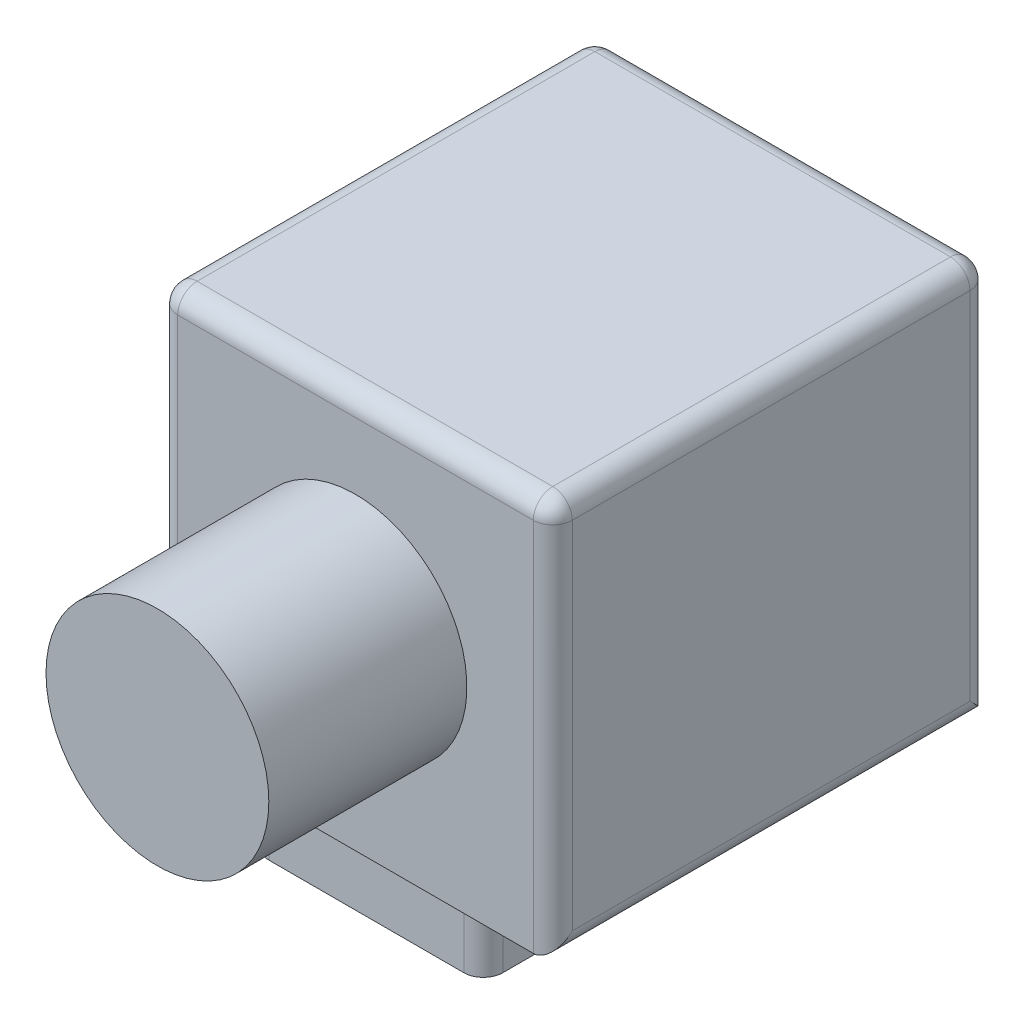
ISO-10303-21;
HEADER;
FILE_DESCRIPTION(('STEP AP214'),'2;1');
FILE_NAME('part.step','',(''),(''),'','','');
FILE_SCHEMA(('AUTOMOTIVE_DESIGN { 1 0 10303 214 1 1 1 1 }'));
ENDSEC;
DATA;
#1=APPLICATION_CONTEXT('core data for automotive mechanical design processes');
#2=APPLICATION_PROTOCOL_DEFINITION('international standard','automotive_design',2000,#1);
#3=PRODUCT_CONTEXT('',#1,'mechanical');
#4=PRODUCT('Part','Part','',(#3));
#5=PRODUCT_RELATED_PRODUCT_CATEGORY('part','',(#4));
#6=PRODUCT_DEFINITION_FORMATION('','',#4);
#7=PRODUCT_DEFINITION_CONTEXT('part definition',#1,'design');
#8=PRODUCT_DEFINITION('design','',#6,#7);
#9=PRODUCT_DEFINITION_SHAPE('','',#8);
#10=(LENGTH_UNIT() NAMED_UNIT(*) SI_UNIT(.MILLI.,.METRE.));
#11=(NAMED_UNIT(*) PLANE_ANGLE_UNIT() SI_UNIT($,.RADIAN.));
#12=(NAMED_UNIT(*) SI_UNIT($,.STERADIAN.) SOLID_ANGLE_UNIT());
#13=UNCERTAINTY_MEASURE_WITH_UNIT(LENGTH_MEASURE(1.E-05),#10,'distance_accuracy_value','');
#14=(GEOMETRIC_REPRESENTATION_CONTEXT(3) GLOBAL_UNCERTAINTY_ASSIGNED_CONTEXT((#13)) GLOBAL_UNIT_ASSIGNED_CONTEXT((#10,
#11,#12)) REPRESENTATION_CONTEXT('',''));
#15=CARTESIAN_POINT('',(0.,0.,0.));
#16=DIRECTION('',(0.,0.,1.));
#17=DIRECTION('',(1.,0.,0.));
#18=AXIS2_PLACEMENT_3D('',#15,#16,#17);
#19=CARTESIAN_POINT('',(0.,50.6,0.));
#20=DIRECTION('',(0.,0.,-1.));
#21=DIRECTION('',(-1.,0.,0.));
#22=AXIS2_PLACEMENT_3D('',#19,#20,#21);
#23=PLANE('',#22);
#24=DIRECTION('',(1.,0.,0.));
#25=VECTOR('',#24,1.);
#26=CARTESIAN_POINT('',(0.,48.1,0.));
#27=LINE('',#26,#25);
#28=CARTESIAN_POINT('',(48.1,48.1,0.));
#29=VERTEX_POINT('',#28);
#30=CARTESIAN_POINT('',(2.5,48.1,0.));
#31=VERTEX_POINT('',#30);
#32=EDGE_CURVE('E266',#29,#31,#27,.F.);
#33=ORIENTED_EDGE('',*,*,#32,.T.);
#34=DIRECTION('',(0.,-1.,0.));
#35=VECTOR('',#34,1.);
#36=CARTESIAN_POINT('',(2.5,50.6,0.));
#37=LINE('',#36,#35);
#38=CARTESIAN_POINT('',(2.5,0.,0.));
#39=VERTEX_POINT('',#38);
#40=EDGE_CURVE('E270',#31,#39,#37,.T.);
#41=ORIENTED_EDGE('',*,*,#40,.T.);
#42=DIRECTION('',(1.,0.,0.));
#43=VECTOR('',#42,1.);
#44=CARTESIAN_POINT('',(0.,0.,0.));
#45=LINE('',#44,#43);
#46=CARTESIAN_POINT('',(48.1,0.,0.));
#47=VERTEX_POINT('',#46);
#48=EDGE_CURVE('E223',#39,#47,#45,.T.);
#49=ORIENTED_EDGE('',*,*,#48,.T.);
#50=DIRECTION('',(0.,-1.,0.));
#51=VECTOR('',#50,1.);
#52=CARTESIAN_POINT('',(48.1,50.6,0.));
#53=LINE('',#52,#51);
#54=EDGE_CURVE('E268',#47,#29,#53,.F.);
#55=ORIENTED_EDGE('',*,*,#54,.T.);
#56=EDGE_LOOP('',(#33,#41,#49,#55));
#57=FACE_BOUND('',#56,.T.);
#58=CARTESIAN_POINT('',(25.3,25.3,0.));
#59=DIRECTION('',(0.,0.,-1.));
#60=DIRECTION('',(-1.,0.,0.));
#61=AXIS2_PLACEMENT_3D('',#58,#59,#60);
#62=CIRCLE('',#61,14.2875);
#63=CARTESIAN_POINT('',(11.0125,25.3,0.));
#64=VERTEX_POINT('',#63);
#65=EDGE_CURVE('E238',#64,#64,#62,.F.);
#66=ORIENTED_EDGE('',*,*,#65,.F.);
#67=EDGE_LOOP('',(#66));
#68=FACE_BOUND('',#67,.T.);
#69=ADVANCED_FACE('F38',(#57,#68),#23,.F.);
#70=CARTESIAN_POINT('',(0.,0.,-56.));
#71=DIRECTION('',(0.,-1.,0.));
#72=DIRECTION('',(0.,0.,-1.));
#73=AXIS2_PLACEMENT_3D('',#70,#71,#72);
#74=PLANE('',#73);
#75=ORIENTED_EDGE('',*,*,#48,.F.);
#76=DIRECTION('',(0.,0.,1.));
#77=VECTOR('',#76,1.);
#78=CARTESIAN_POINT('',(2.5,0.,-56.));
#79=LINE('',#78,#77);
#80=CARTESIAN_POINT('',(2.5,0.,-56.));
#81=VERTEX_POINT('',#80);
#82=EDGE_CURVE('E310',#39,#81,#79,.F.);
#83=ORIENTED_EDGE('',*,*,#82,.T.);
#84=DIRECTION('',(-1.,0.,0.));
#85=VECTOR('',#84,1.);
#86=CARTESIAN_POINT('',(0.,0.,-56.));
#87=LINE('',#86,#85);
#88=CARTESIAN_POINT('',(48.1,0.,-56.));
#89=VERTEX_POINT('',#88);
#90=EDGE_CURVE('E235',#89,#81,#87,.T.);
#91=ORIENTED_EDGE('',*,*,#90,.F.);
#92=DIRECTION('',(0.,0.,-1.));
#93=VECTOR('',#92,1.);
#94=CARTESIAN_POINT('',(48.1,0.,0.));
#95=LINE('',#94,#93);
#96=EDGE_CURVE('E308',#89,#47,#95,.F.);
#97=ORIENTED_EDGE('',*,*,#96,.T.);
#98=EDGE_LOOP('',(#75,#83,#91,#97));
#99=FACE_BOUND('',#98,.T.);
#100=DIRECTION('',(1.,0.,0.));
#101=VECTOR('',#100,1.);
#102=CARTESIAN_POINT('',(10.3,0.,-54.6));
#103=LINE('',#102,#101);
#104=CARTESIAN_POINT('',(12.8,0.,-54.6));
#105=VERTEX_POINT('',#104);
#106=CARTESIAN_POINT('',(37.8,0.,-54.6));
#107=VERTEX_POINT('',#106);
#108=EDGE_CURVE('E226',#105,#107,#103,.T.);
#109=ORIENTED_EDGE('',*,*,#108,.F.);
#110=CARTESIAN_POINT('',(12.8,0.,-52.1));
#111=DIRECTION('',(0.,-1.,0.));
#112=DIRECTION('',(0.,0.,-1.));
#113=AXIS2_PLACEMENT_3D('',#110,#111,#112);
#114=CIRCLE('',#113,2.5);
#115=CARTESIAN_POINT('',(10.3,0.,-52.1));
#116=VERTEX_POINT('',#115);
#117=EDGE_CURVE('E314',#105,#116,#114,.F.);
#118=ORIENTED_EDGE('',*,*,#117,.T.);
#119=DIRECTION('',(0.,0.,-1.));
#120=VECTOR('',#119,1.);
#121=CARTESIAN_POINT('',(10.3,0.,-1.4));
#122=LINE('',#121,#120);
#123=CARTESIAN_POINT('',(10.3,0.,-3.9));
#124=VERTEX_POINT('',#123);
#125=EDGE_CURVE('E209',#124,#116,#122,.T.);
#126=ORIENTED_EDGE('',*,*,#125,.F.);
#127=CARTESIAN_POINT('',(12.8,0.,-3.9));
#128=DIRECTION('',(0.,-1.,0.));
#129=DIRECTION('',(0.,0.,-1.));
#130=AXIS2_PLACEMENT_3D('',#127,#128,#129);
#131=CIRCLE('',#130,2.5);
#132=CARTESIAN_POINT('',(12.8,0.,-1.4));
#133=VERTEX_POINT('',#132);
#134=EDGE_CURVE('E11',#124,#133,#131,.F.);
#135=ORIENTED_EDGE('',*,*,#134,.T.);
#136=DIRECTION('',(-1.,0.,0.));
#137=VECTOR('',#136,1.);
#138=CARTESIAN_POINT('',(10.3,0.,-1.4));
#139=LINE('',#138,#137);
#140=CARTESIAN_POINT('',(37.8,0.,-1.39999999999999));
#141=VERTEX_POINT('',#140);
#142=EDGE_CURVE('E214',#141,#133,#139,.T.);
#143=ORIENTED_EDGE('',*,*,#142,.F.);
#144=CARTESIAN_POINT('',(37.8,0.,-3.89999999999999));
#145=DIRECTION('',(0.,-1.,0.));
#146=DIRECTION('',(0.,0.,-1.));
#147=AXIS2_PLACEMENT_3D('',#144,#145,#146);
#148=CIRCLE('',#147,2.5);
#149=CARTESIAN_POINT('',(40.3,0.,-3.89999999999999));
#150=VERTEX_POINT('',#149);
#151=EDGE_CURVE('E47',#141,#150,#148,.F.);
#152=ORIENTED_EDGE('',*,*,#151,.T.);
#153=DIRECTION('',(0.,0.,1.));
#154=VECTOR('',#153,1.);
#155=CARTESIAN_POINT('',(40.3,0.,-1.39999999999999));
#156=LINE('',#155,#154);
#157=CARTESIAN_POINT('',(40.3,0.,-52.1));
#158=VERTEX_POINT('',#157);
#159=EDGE_CURVE('E229',#158,#150,#156,.T.);
#160=ORIENTED_EDGE('',*,*,#159,.F.);
#161=CARTESIAN_POINT('',(37.8,0.,-52.1));
#162=DIRECTION('',(0.,-1.,0.));
#163=DIRECTION('',(0.,0.,-1.));
#164=AXIS2_PLACEMENT_3D('',#161,#162,#163);
#165=CIRCLE('',#164,2.5);
#166=EDGE_CURVE('E312',#158,#107,#165,.F.);
#167=ORIENTED_EDGE('',*,*,#166,.T.);
#168=EDGE_LOOP('',(#109,#118,#126,#135,#143,#152,#160,#167));
#169=FACE_BOUND('',#168,.T.);
#170=ADVANCED_FACE('F378',(#99,#169),#74,.T.);
#171=CARTESIAN_POINT('',(0.,50.6,0.));
#172=DIRECTION('',(1.,0.,0.));
#173=DIRECTION('',(0.,0.,-1.));
#174=AXIS2_PLACEMENT_3D('',#171,#172,#173);
#175=PLANE('',#174);
#176=DIRECTION('',(0.,-1.,0.));
#177=VECTOR('',#176,1.);
#178=CARTESIAN_POINT('',(0.,50.6,-53.5));
#179=LINE('',#178,#177);
#180=CARTESIAN_POINT('',(0.,48.1,-53.5));
#181=VERTEX_POINT('',#180);
#182=CARTESIAN_POINT('',(0.,2.5,-53.5));
#183=VERTEX_POINT('',#182);
#184=EDGE_CURVE('E245',#181,#183,#179,.T.);
#185=ORIENTED_EDGE('',*,*,#184,.T.);
#186=DIRECTION('',(0.,0.,1.));
#187=VECTOR('',#186,1.);
#188=CARTESIAN_POINT('',(0.,2.5,0.));
#189=LINE('',#188,#187);
#190=CARTESIAN_POINT('',(0.,2.5,-2.5));
#191=VERTEX_POINT('',#190);
#192=EDGE_CURVE('E248',#183,#191,#189,.T.);
#193=ORIENTED_EDGE('',*,*,#192,.T.);
#194=DIRECTION('',(0.,-1.,0.));
#195=VECTOR('',#194,1.);
#196=CARTESIAN_POINT('',(0.,50.6,-2.5));
#197=LINE('',#196,#195);
#198=CARTESIAN_POINT('',(0.,48.1,-2.5));
#199=VERTEX_POINT('',#198);
#200=EDGE_CURVE('E243',#191,#199,#197,.F.);
#201=ORIENTED_EDGE('',*,*,#200,.T.);
#202=DIRECTION('',(0.,0.,1.));
#203=VECTOR('',#202,1.);
#204=CARTESIAN_POINT('',(0.,48.1,0.));
#205=LINE('',#204,#203);
#206=EDGE_CURVE('E241',#199,#181,#205,.F.);
#207=ORIENTED_EDGE('',*,*,#206,.T.);
#208=EDGE_LOOP('',(#185,#193,#201,#207));
#209=FACE_BOUND('',#208,.T.);
#210=ADVANCED_FACE('F384',(#209),#175,.F.);
#211=CARTESIAN_POINT('',(50.6,50.6,0.));
#212=DIRECTION('',(-1.,0.,0.));
#213=DIRECTION('',(0.,0.,1.));
#214=AXIS2_PLACEMENT_3D('',#211,#212,#213);
#215=PLANE('',#214);
#216=DIRECTION('',(0.,-1.,0.));
#217=VECTOR('',#216,1.);
#218=CARTESIAN_POINT('',(50.6,50.6,-2.5));
#219=LINE('',#218,#217);
#220=CARTESIAN_POINT('',(50.6,48.1,-2.5));
#221=VERTEX_POINT('',#220);
#222=CARTESIAN_POINT('',(50.6,2.5,-2.5));
#223=VERTEX_POINT('',#222);
#224=EDGE_CURVE('E259',#221,#223,#219,.T.);
#225=ORIENTED_EDGE('',*,*,#224,.T.);
#226=DIRECTION('',(0.,0.,-1.));
#227=VECTOR('',#226,1.);
#228=CARTESIAN_POINT('',(50.6,2.5,-56.));
#229=LINE('',#228,#227);
#230=CARTESIAN_POINT('',(50.6,2.5,-53.5));
#231=VERTEX_POINT('',#230);
#232=EDGE_CURVE('E264',#223,#231,#229,.T.);
#233=ORIENTED_EDGE('',*,*,#232,.T.);
#234=DIRECTION('',(0.,-1.,0.));
#235=VECTOR('',#234,1.);
#236=CARTESIAN_POINT('',(50.6,50.6,-53.5));
#237=LINE('',#236,#235);
#238=CARTESIAN_POINT('',(50.6,48.1,-53.5));
#239=VERTEX_POINT('',#238);
#240=EDGE_CURVE('E261',#231,#239,#237,.F.);
#241=ORIENTED_EDGE('',*,*,#240,.T.);
#242=DIRECTION('',(0.,0.,-1.));
#243=VECTOR('',#242,1.);
#244=CARTESIAN_POINT('',(50.6,48.1,0.));
#245=LINE('',#244,#243);
#246=EDGE_CURVE('E257',#239,#221,#245,.F.);
#247=ORIENTED_EDGE('',*,*,#246,.T.);
#248=EDGE_LOOP('',(#225,#233,#241,#247));
#249=FACE_BOUND('',#248,.T.);
#250=ADVANCED_FACE('F389',(#249),#215,.F.);
#251=CARTESIAN_POINT('',(0.,50.6,-56.));
#252=DIRECTION('',(0.,0.,1.));
#253=DIRECTION('',(1.,0.,0.));
#254=AXIS2_PLACEMENT_3D('',#251,#252,#253);
#255=PLANE('',#254);
#256=ORIENTED_EDGE('',*,*,#90,.T.);
#257=DIRECTION('',(0.,-1.,0.));
#258=VECTOR('',#257,1.);
#259=CARTESIAN_POINT('',(2.5,50.6,-56.));
#260=LINE('',#259,#258);
#261=CARTESIAN_POINT('',(2.5,48.1,-56.));
#262=VERTEX_POINT('',#261);
#263=EDGE_CURVE('E254',#81,#262,#260,.F.);
#264=ORIENTED_EDGE('',*,*,#263,.T.);
#265=DIRECTION('',(-1.,0.,0.));
#266=VECTOR('',#265,1.);
#267=CARTESIAN_POINT('',(0.,48.1,-56.));
#268=LINE('',#267,#266);
#269=CARTESIAN_POINT('',(48.1,48.1,-56.));
#270=VERTEX_POINT('',#269);
#271=EDGE_CURVE('E250',#262,#270,#268,.F.);
#272=ORIENTED_EDGE('',*,*,#271,.T.);
#273=DIRECTION('',(0.,-1.,0.));
#274=VECTOR('',#273,1.);
#275=CARTESIAN_POINT('',(48.1,50.6,-56.));
#276=LINE('',#275,#274);
#277=EDGE_CURVE('E252',#270,#89,#276,.T.);
#278=ORIENTED_EDGE('',*,*,#277,.T.);
#279=EDGE_LOOP('',(#256,#264,#272,#278));
#280=FACE_BOUND('',#279,.T.);
#281=ADVANCED_FACE('F501',(#280),#255,.F.);
#282=CARTESIAN_POINT('',(0.,50.6,-56.));
#283=DIRECTION('',(0.,-1.,0.));
#284=DIRECTION('',(0.,0.,-1.));
#285=AXIS2_PLACEMENT_3D('',#282,#283,#284);
#286=PLANE('',#285);
#287=DIRECTION('',(-1.,0.,0.));
#288=VECTOR('',#287,1.);
#289=CARTESIAN_POINT('',(0.,50.6,-53.5));
#290=LINE('',#289,#288);
#291=CARTESIAN_POINT('',(48.1,50.6,-53.5));
#292=VERTEX_POINT('',#291);
#293=CARTESIAN_POINT('',(2.5,50.6,-53.5));
#294=VERTEX_POINT('',#293);
#295=EDGE_CURVE('E274',#292,#294,#290,.T.);
#296=ORIENTED_EDGE('',*,*,#295,.T.);
#297=DIRECTION('',(0.,0.,1.));
#298=VECTOR('',#297,1.);
#299=CARTESIAN_POINT('',(2.5,50.6,-56.));
#300=LINE('',#299,#298);
#301=CARTESIAN_POINT('',(2.5,50.6,-2.5));
#302=VERTEX_POINT('',#301);
#303=EDGE_CURVE('E279',#294,#302,#300,.T.);
#304=ORIENTED_EDGE('',*,*,#303,.T.);
#305=DIRECTION('',(1.,0.,0.));
#306=VECTOR('',#305,1.);
#307=CARTESIAN_POINT('',(0.,50.6,-2.5));
#308=LINE('',#307,#306);
#309=CARTESIAN_POINT('',(48.1,50.6,-2.5));
#310=VERTEX_POINT('',#309);
#311=EDGE_CURVE('E276',#302,#310,#308,.T.);
#312=ORIENTED_EDGE('',*,*,#311,.T.);
#313=DIRECTION('',(0.,0.,-1.));
#314=VECTOR('',#313,1.);
#315=CARTESIAN_POINT('',(48.1,50.6,-56.));
#316=LINE('',#315,#314);
#317=EDGE_CURVE('E272',#310,#292,#316,.T.);
#318=ORIENTED_EDGE('',*,*,#317,.T.);
#319=EDGE_LOOP('',(#296,#304,#312,#318));
#320=FACE_BOUND('',#319,.T.);
#321=ADVANCED_FACE('F499',(#320),#286,.F.);
#322=CARTESIAN_POINT('',(10.3,-8.,-1.4));
#323=DIRECTION('',(1.,0.,0.));
#324=DIRECTION('',(0.,0.,-1.));
#325=AXIS2_PLACEMENT_3D('',#322,#323,#324);
#326=PLANE('',#325);
#327=ORIENTED_EDGE('',*,*,#125,.T.);
#328=DIRECTION('',(0.,1.,0.));
#329=VECTOR('',#328,1.);
#330=CARTESIAN_POINT('',(10.3,-8.,-52.1));
#331=LINE('',#330,#329);
#332=CARTESIAN_POINT('',(10.3,-8.,-52.1));
#333=VERTEX_POINT('',#332);
#334=EDGE_CURVE('E302',#116,#333,#331,.F.);
#335=ORIENTED_EDGE('',*,*,#334,.T.);
#336=DIRECTION('',(0.,0.,-1.));
#337=VECTOR('',#336,1.);
#338=CARTESIAN_POINT('',(10.3,-8.,-1.4));
#339=LINE('',#338,#337);
#340=CARTESIAN_POINT('',(10.3,-8.,-3.9));
#341=VERTEX_POINT('',#340);
#342=EDGE_CURVE('E210',#341,#333,#339,.T.);
#343=ORIENTED_EDGE('',*,*,#342,.F.);
#344=DIRECTION('',(0.,1.,0.));
#345=VECTOR('',#344,1.);
#346=CARTESIAN_POINT('',(10.3,-8.,-3.9));
#347=LINE('',#346,#345);
#348=EDGE_CURVE('E299',#341,#124,#347,.T.);
#349=ORIENTED_EDGE('',*,*,#348,.T.);
#350=EDGE_LOOP('',(#327,#335,#343,#349));
#351=FACE_BOUND('',#350,.T.);
#352=ADVANCED_FACE('F474',(#351),#326,.F.);
#353=CARTESIAN_POINT('',(10.3,-8.,-54.6));
#354=DIRECTION('',(0.,0.,1.));
#355=DIRECTION('',(1.,0.,0.));
#356=AXIS2_PLACEMENT_3D('',#353,#354,#355);
#357=PLANE('',#356);
#358=ORIENTED_EDGE('',*,*,#108,.T.);
#359=DIRECTION('',(0.,1.,0.));
#360=VECTOR('',#359,1.);
#361=CARTESIAN_POINT('',(37.8,-8.,-54.6));
#362=LINE('',#361,#360);
#363=CARTESIAN_POINT('',(37.8,-8.,-54.6));
#364=VERTEX_POINT('',#363);
#365=EDGE_CURVE('E289',#107,#364,#362,.F.);
#366=ORIENTED_EDGE('',*,*,#365,.T.);
#367=DIRECTION('',(1.,0.,0.));
#368=VECTOR('',#367,1.);
#369=CARTESIAN_POINT('',(10.3,-8.,-54.6));
#370=LINE('',#369,#368);
#371=CARTESIAN_POINT('',(12.8,-8.,-54.6));
#372=VERTEX_POINT('',#371);
#373=EDGE_CURVE('E213',#372,#364,#370,.T.);
#374=ORIENTED_EDGE('',*,*,#373,.F.);
#375=DIRECTION('',(0.,1.,0.));
#376=VECTOR('',#375,1.);
#377=CARTESIAN_POINT('',(12.8,-8.,-54.6));
#378=LINE('',#377,#376);
#379=EDGE_CURVE('E286',#372,#105,#378,.T.);
#380=ORIENTED_EDGE('',*,*,#379,.T.);
#381=EDGE_LOOP('',(#358,#366,#374,#380));
#382=FACE_BOUND('',#381,.T.);
#383=ADVANCED_FACE('F480',(#382),#357,.F.);
#384=CARTESIAN_POINT('',(40.3,-8.,-1.39999999999999));
#385=DIRECTION('',(-1.,0.,0.));
#386=DIRECTION('',(0.,0.,1.));
#387=AXIS2_PLACEMENT_3D('',#384,#385,#386);
#388=PLANE('',#387);
#389=DIRECTION('',(0.,0.,1.));
#390=VECTOR('',#389,1.);
#391=CARTESIAN_POINT('',(40.3,-8.,-1.39999999999999));
#392=LINE('',#391,#390);
#393=CARTESIAN_POINT('',(40.3,-8.,-52.1));
#394=VERTEX_POINT('',#393);
#395=CARTESIAN_POINT('',(40.3,-8.,-3.89999999999999));
#396=VERTEX_POINT('',#395);
#397=EDGE_CURVE('E217',#394,#396,#392,.T.);
#398=ORIENTED_EDGE('',*,*,#397,.F.);
#399=DIRECTION('',(0.,1.,0.));
#400=VECTOR('',#399,1.);
#401=CARTESIAN_POINT('',(40.3,-8.,-52.1));
#402=LINE('',#401,#400);
#403=EDGE_CURVE('E283',#394,#158,#402,.T.);
#404=ORIENTED_EDGE('',*,*,#403,.T.);
#405=ORIENTED_EDGE('',*,*,#159,.T.);
#406=DIRECTION('',(0.,1.,0.));
#407=VECTOR('',#406,1.);
#408=CARTESIAN_POINT('',(40.3,-8.,-3.89999999999999));
#409=LINE('',#408,#407);
#410=EDGE_CURVE('E281',#150,#396,#409,.F.);
#411=ORIENTED_EDGE('',*,*,#410,.T.);
#412=EDGE_LOOP('',(#398,#404,#405,#411));
#413=FACE_BOUND('',#412,.T.);
#414=ADVANCED_FACE('F485',(#413),#388,.F.);
#415=CARTESIAN_POINT('',(10.3,-8.,-1.4));
#416=DIRECTION('',(0.,0.,-1.));
#417=DIRECTION('',(-1.,0.,0.));
#418=AXIS2_PLACEMENT_3D('',#415,#416,#417);
#419=PLANE('',#418);
#420=DIRECTION('',(-1.,0.,0.));
#421=VECTOR('',#420,1.);
#422=CARTESIAN_POINT('',(10.3,-8.,-1.4));
#423=LINE('',#422,#421);
#424=CARTESIAN_POINT('',(37.8,-8.,-1.39999999999999));
#425=VERTEX_POINT('',#424);
#426=CARTESIAN_POINT('',(12.8,-8.,-1.4));
#427=VERTEX_POINT('',#426);
#428=EDGE_CURVE('E220',#425,#427,#423,.T.);
#429=ORIENTED_EDGE('',*,*,#428,.F.);
#430=DIRECTION('',(0.,1.,0.));
#431=VECTOR('',#430,1.);
#432=CARTESIAN_POINT('',(37.8,-8.,-1.39999999999999));
#433=LINE('',#432,#431);
#434=EDGE_CURVE('E306',#425,#141,#433,.T.);
#435=ORIENTED_EDGE('',*,*,#434,.T.);
#436=ORIENTED_EDGE('',*,*,#142,.T.);
#437=DIRECTION('',(0.,1.,0.));
#438=VECTOR('',#437,1.);
#439=CARTESIAN_POINT('',(12.8,-8.,-1.4));
#440=LINE('',#439,#438);
#441=EDGE_CURVE('E304',#133,#427,#440,.F.);
#442=ORIENTED_EDGE('',*,*,#441,.T.);
#443=EDGE_LOOP('',(#429,#435,#436,#442));
#444=FACE_BOUND('',#443,.T.);
#445=ADVANCED_FACE('F468',(#444),#419,.F.);
#446=CARTESIAN_POINT('',(10.3,-8.,-54.6));
#447=DIRECTION('',(0.,-1.,0.));
#448=DIRECTION('',(0.,0.,-1.));
#449=AXIS2_PLACEMENT_3D('',#446,#447,#448);
#450=PLANE('',#449);
#451=CARTESIAN_POINT('',(25.3,-8.,-22.));
#452=DIRECTION('',(0.,-1.,0.));
#453=DIRECTION('',(0.,0.,-1.));
#454=AXIS2_PLACEMENT_3D('',#451,#452,#453);
#455=CIRCLE('',#454,2.5527);
#456=CARTESIAN_POINT('',(25.3,-8.,-24.5527));
#457=VERTEX_POINT('',#456);
#458=EDGE_CURVE('E185',#457,#457,#455,.T.);
#459=ORIENTED_EDGE('',*,*,#458,.F.);
#460=EDGE_LOOP('',(#459));
#461=FACE_BOUND('',#460,.T.);
#462=CARTESIAN_POINT('',(25.3,-8.,-35.25));
#463=DIRECTION('',(0.,-1.,0.));
#464=DIRECTION('',(0.,0.,-1.));
#465=AXIS2_PLACEMENT_3D('',#462,#463,#464);
#466=CIRCLE('',#465,2.5);
#467=CARTESIAN_POINT('',(25.3,-8.,-37.75));
#468=VERTEX_POINT('',#467);
#469=EDGE_CURVE('E184',#468,#468,#466,.T.);
#470=ORIENTED_EDGE('',*,*,#469,.F.);
#471=EDGE_LOOP('',(#470));
#472=FACE_BOUND('',#471,.T.);
#473=CARTESIAN_POINT('',(25.3,-8.,-48.5));
#474=DIRECTION('',(0.,-1.,0.));
#475=DIRECTION('',(0.,0.,-1.));
#476=AXIS2_PLACEMENT_3D('',#473,#474,#475);
#477=CIRCLE('',#476,2.5);
#478=CARTESIAN_POINT('',(25.3,-8.,-51.));
#479=VERTEX_POINT('',#478);
#480=EDGE_CURVE('E197',#479,#479,#477,.T.);
#481=ORIENTED_EDGE('',*,*,#480,.F.);
#482=EDGE_LOOP('',(#481));
#483=FACE_BOUND('',#482,.T.);
#484=CARTESIAN_POINT('',(25.3,-8.,-6.3));
#485=DIRECTION('',(0.,-1.,0.));
#486=DIRECTION('',(0.,0.,-1.));
#487=AXIS2_PLACEMENT_3D('',#484,#485,#486);
#488=CIRCLE('',#487,2.5);
#489=CARTESIAN_POINT('',(25.3,-8.,-8.8));
#490=VERTEX_POINT('',#489);
#491=EDGE_CURVE('E203',#490,#490,#488,.T.);
#492=ORIENTED_EDGE('',*,*,#491,.F.);
#493=EDGE_LOOP('',(#492));
#494=FACE_BOUND('',#493,.T.);
#495=ORIENTED_EDGE('',*,*,#373,.T.);
#496=CARTESIAN_POINT('',(37.8,-8.,-52.1));
#497=DIRECTION('',(0.,-1.,0.));
#498=DIRECTION('',(0.,0.,-1.));
#499=AXIS2_PLACEMENT_3D('',#496,#497,#498);
#500=CIRCLE('',#499,2.5);
#501=EDGE_CURVE('E297',#364,#394,#500,.T.);
#502=ORIENTED_EDGE('',*,*,#501,.T.);
#503=ORIENTED_EDGE('',*,*,#397,.T.);
#504=CARTESIAN_POINT('',(37.8,-8.,-3.89999999999999));
#505=DIRECTION('',(0.,-1.,0.));
#506=DIRECTION('',(0.,0.,-1.));
#507=AXIS2_PLACEMENT_3D('',#504,#505,#506);
#508=CIRCLE('',#507,2.5);
#509=EDGE_CURVE('E293',#396,#425,#508,.T.);
#510=ORIENTED_EDGE('',*,*,#509,.T.);
#511=ORIENTED_EDGE('',*,*,#428,.T.);
#512=CARTESIAN_POINT('',(12.8,-8.,-3.9));
#513=DIRECTION('',(0.,-1.,0.));
#514=DIRECTION('',(0.,0.,-1.));
#515=AXIS2_PLACEMENT_3D('',#512,#513,#514);
#516=CIRCLE('',#515,2.5);
#517=EDGE_CURVE('E291',#427,#341,#516,.T.);
#518=ORIENTED_EDGE('',*,*,#517,.T.);
#519=ORIENTED_EDGE('',*,*,#342,.T.);
#520=CARTESIAN_POINT('',(12.8,-8.,-52.1));
#521=DIRECTION('',(0.,-1.,0.));
#522=DIRECTION('',(0.,0.,-1.));
#523=AXIS2_PLACEMENT_3D('',#520,#521,#522);
#524=CIRCLE('',#523,2.5);
#525=EDGE_CURVE('E295',#333,#372,#524,.T.);
#526=ORIENTED_EDGE('',*,*,#525,.T.);
#527=EDGE_LOOP('',(#495,#502,#503,#510,#511,#518,#519,#526));
#528=FACE_BOUND('',#527,.T.);
#529=ADVANCED_FACE('F464',(#461,#472,#483,#494,#528),#450,.T.);
#530=CARTESIAN_POINT('',(25.3,-0.499989600000001,-6.3));
#531=DIRECTION('',(0.,-1.,0.));
#532=DIRECTION('',(0.,0.,-1.));
#533=AXIS2_PLACEMENT_3D('',#530,#531,#532);
#534=CONICAL_SURFACE('',#533,2.5,1.02974425867665);
#535=CARTESIAN_POINT('',(25.3,1.0021619475689,-6.3));
#536=VERTEX_POINT('',#535);
#537=VERTEX_LOOP('',#536);
#538=FACE_BOUND('',#537,.T.);
#539=CARTESIAN_POINT('',(25.3,-0.499989600000001,-6.3));
#540=DIRECTION('',(0.,-1.,0.));
#541=DIRECTION('',(0.,0.,-1.));
#542=AXIS2_PLACEMENT_3D('',#539,#540,#541);
#543=CIRCLE('',#542,2.5);
#544=CARTESIAN_POINT('',(25.3,-0.499989600000001,-8.8));
#545=VERTEX_POINT('',#544);
#546=EDGE_CURVE('E206',#545,#545,#543,.T.);
#547=ORIENTED_EDGE('',*,*,#546,.T.);
#548=EDGE_LOOP('',(#547));
#549=FACE_BOUND('',#548,.T.);
#550=ADVANCED_FACE('F646',(#538,#549),#534,.F.);
#551=CARTESIAN_POINT('',(25.3,-8.,-6.3));
#552=DIRECTION('',(0.,-1.,0.));
#553=DIRECTION('',(0.,0.,-1.));
#554=AXIS2_PLACEMENT_3D('',#551,#552,#553);
#555=CYLINDRICAL_SURFACE('',#554,2.5);
#556=ORIENTED_EDGE('',*,*,#546,.F.);
#557=EDGE_LOOP('',(#556));
#558=FACE_BOUND('',#557,.T.);
#559=ORIENTED_EDGE('',*,*,#491,.T.);
#560=EDGE_LOOP('',(#559));
#561=FACE_BOUND('',#560,.T.);
#562=ADVANCED_FACE('F636',(#558,#561),#555,.F.);
#563=CARTESIAN_POINT('',(25.3,-0.499989600000001,-48.5));
#564=DIRECTION('',(0.,-1.,0.));
#565=DIRECTION('',(0.,0.,-1.));
#566=AXIS2_PLACEMENT_3D('',#563,#564,#565);
#567=CONICAL_SURFACE('',#566,2.5,1.02974425867665);
#568=CARTESIAN_POINT('',(25.3,1.0021619475689,-48.5));
#569=VERTEX_POINT('',#568);
#570=VERTEX_LOOP('',#569);
#571=FACE_BOUND('',#570,.T.);
#572=CARTESIAN_POINT('',(25.3,-0.499989600000001,-48.5));
#573=DIRECTION('',(0.,-1.,0.));
#574=DIRECTION('',(0.,0.,-1.));
#575=AXIS2_PLACEMENT_3D('',#572,#573,#574);
#576=CIRCLE('',#575,2.5);
#577=CARTESIAN_POINT('',(25.3,-0.499989600000001,-51.));
#578=VERTEX_POINT('',#577);
#579=EDGE_CURVE('E200',#578,#578,#576,.T.);
#580=ORIENTED_EDGE('',*,*,#579,.T.);
#581=EDGE_LOOP('',(#580));
#582=FACE_BOUND('',#581,.T.);
#583=ADVANCED_FACE('F625',(#571,#582),#567,.F.);
#584=CARTESIAN_POINT('',(25.3,-8.,-48.5));
#585=DIRECTION('',(0.,-1.,0.));
#586=DIRECTION('',(0.,0.,-1.));
#587=AXIS2_PLACEMENT_3D('',#584,#585,#586);
#588=CYLINDRICAL_SURFACE('',#587,2.5);
#589=ORIENTED_EDGE('',*,*,#579,.F.);
#590=EDGE_LOOP('',(#589));
#591=FACE_BOUND('',#590,.T.);
#592=ORIENTED_EDGE('',*,*,#480,.T.);
#593=EDGE_LOOP('',(#592));
#594=FACE_BOUND('',#593,.T.);
#595=ADVANCED_FACE('F615',(#591,#594),#588,.F.);
#596=CARTESIAN_POINT('',(25.3,-0.499989600000001,-35.25));
#597=DIRECTION('',(0.,-1.,0.));
#598=DIRECTION('',(0.,0.,-1.));
#599=AXIS2_PLACEMENT_3D('',#596,#597,#598);
#600=CONICAL_SURFACE('',#599,2.5,1.02974425867665);
#601=CARTESIAN_POINT('',(25.3,1.0021619475689,-35.25));
#602=VERTEX_POINT('',#601);
#603=VERTEX_LOOP('',#602);
#604=FACE_BOUND('',#603,.T.);
#605=CARTESIAN_POINT('',(25.3,-0.499989600000001,-35.25));
#606=DIRECTION('',(0.,-1.,0.));
#607=DIRECTION('',(0.,0.,-1.));
#608=AXIS2_PLACEMENT_3D('',#605,#606,#607);
#609=CIRCLE('',#608,2.5);
#610=CARTESIAN_POINT('',(25.3,-0.499989600000001,-37.75));
#611=VERTEX_POINT('',#610);
#612=EDGE_CURVE('E188',#611,#611,#609,.T.);
#613=ORIENTED_EDGE('',*,*,#612,.T.);
#614=EDGE_LOOP('',(#613));
#615=FACE_BOUND('',#614,.T.);
#616=ADVANCED_FACE('F604',(#604,#615),#600,.F.);
#617=CARTESIAN_POINT('',(25.3,-8.,-35.25));
#618=DIRECTION('',(0.,-1.,0.));
#619=DIRECTION('',(0.,0.,-1.));
#620=AXIS2_PLACEMENT_3D('',#617,#618,#619);
#621=CYLINDRICAL_SURFACE('',#620,2.5);
#622=ORIENTED_EDGE('',*,*,#612,.F.);
#623=EDGE_LOOP('',(#622));
#624=FACE_BOUND('',#623,.T.);
#625=ORIENTED_EDGE('',*,*,#469,.T.);
#626=EDGE_LOOP('',(#625));
#627=FACE_BOUND('',#626,.T.);
#628=ADVANCED_FACE('F178',(#624,#627),#621,.F.);
#629=CARTESIAN_POINT('',(25.3,-0.380000000000001,-22.));
#630=DIRECTION('',(0.,-1.,0.));
#631=DIRECTION('',(0.,0.,-1.));
#632=AXIS2_PLACEMENT_3D('',#629,#630,#631);
#633=CONICAL_SURFACE('',#632,2.5527,1.02974425867665);
#634=CARTESIAN_POINT('',(25.3,1.15381690219165,-22.));
#635=VERTEX_POINT('',#634);
#636=VERTEX_LOOP('',#635);
#637=FACE_BOUND('',#636,.T.);
#638=CARTESIAN_POINT('',(25.3,-0.380000000000001,-22.));
#639=DIRECTION('',(0.,-1.,0.));
#640=DIRECTION('',(0.,0.,-1.));
#641=AXIS2_PLACEMENT_3D('',#638,#639,#640);
#642=CIRCLE('',#641,2.5527);
#643=CARTESIAN_POINT('',(25.3,-0.380000000000001,-24.5527));
#644=VERTEX_POINT('',#643);
#645=EDGE_CURVE('E182',#644,#644,#642,.T.);
#646=ORIENTED_EDGE('',*,*,#645,.T.);
#647=EDGE_LOOP('',(#646));
#648=FACE_BOUND('',#647,.T.);
#649=ADVANCED_FACE('F174',(#637,#648),#633,.F.);
#650=CARTESIAN_POINT('',(25.3,-8.,-22.));
#651=DIRECTION('',(0.,-1.,0.));
#652=DIRECTION('',(0.,0.,-1.));
#653=AXIS2_PLACEMENT_3D('',#650,#651,#652);
#654=CYLINDRICAL_SURFACE('',#653,2.5527);
#655=ORIENTED_EDGE('',*,*,#645,.F.);
#656=EDGE_LOOP('',(#655));
#657=FACE_BOUND('',#656,.T.);
#658=ORIENTED_EDGE('',*,*,#458,.T.);
#659=EDGE_LOOP('',(#658));
#660=FACE_BOUND('',#659,.T.);
#661=ADVANCED_FACE('F177',(#657,#660),#654,.F.);
#662=CARTESIAN_POINT('',(25.3,25.3,25.4));
#663=DIRECTION('',(0.,0.,-1.));
#664=DIRECTION('',(-1.,0.,0.));
#665=AXIS2_PLACEMENT_3D('',#662,#663,#664);
#666=CYLINDRICAL_SURFACE('',#665,14.2875);
#667=CARTESIAN_POINT('',(25.3,25.3,25.4));
#668=DIRECTION('',(0.,0.,1.));
#669=DIRECTION('',(1.,0.,0.));
#670=AXIS2_PLACEMENT_3D('',#667,#668,#669);
#671=CIRCLE('',#670,14.2875);
#672=CARTESIAN_POINT('',(39.5875,25.3,25.4));
#673=VERTEX_POINT('',#672);
#674=EDGE_CURVE('E191',#673,#673,#671,.T.);
#675=ORIENTED_EDGE('',*,*,#674,.F.);
#676=EDGE_LOOP('',(#675));
#677=FACE_BOUND('',#676,.T.);
#678=ORIENTED_EDGE('',*,*,#65,.T.);
#679=EDGE_LOOP('',(#678));
#680=FACE_BOUND('',#679,.T.);
#681=ADVANCED_FACE('F371',(#677,#680),#666,.T.);
#682=CARTESIAN_POINT('',(25.3,25.3,25.4));
#683=DIRECTION('',(0.,0.,1.));
#684=DIRECTION('',(1.,0.,0.));
#685=AXIS2_PLACEMENT_3D('',#682,#683,#684);
#686=PLANE('',#685);
#687=ORIENTED_EDGE('',*,*,#674,.T.);
#688=EDGE_LOOP('',(#687));
#689=FACE_BOUND('',#688,.T.);
#690=ADVANCED_FACE('F369',(#689),#686,.T.);
#691=CARTESIAN_POINT('',(48.1,50.6,-2.5));
#692=DIRECTION('',(0.,-1.,0.));
#693=DIRECTION('',(0.,0.,-1.));
#694=AXIS2_PLACEMENT_3D('',#691,#692,#693);
#695=CYLINDRICAL_SURFACE('',#694,2.5);
#696=CARTESIAN_POINT('',(48.1,48.1,-2.5));
#697=DIRECTION('',(0.,1.,0.));
#698=DIRECTION('',(0.,0.,1.));
#699=AXIS2_PLACEMENT_3D('',#696,#697,#698);
#700=CIRCLE('',#699,2.5);
#701=EDGE_CURVE('E355',#29,#221,#700,.T.);
#702=ORIENTED_EDGE('',*,*,#701,.F.);
#703=ORIENTED_EDGE('',*,*,#54,.F.);
#704=CARTESIAN_POINT('',(48.1,2.5,-2.5));
#705=DIRECTION('',(0.,0.707106781186547,0.707106781186547));
#706=DIRECTION('',(0.,-0.707106781186547,0.707106781186547));
#707=AXIS2_PLACEMENT_3D('',#704,#705,#706);
#708=ELLIPSE('',#707,3.53553390593274,2.5);
#709=EDGE_CURVE('E42',#223,#47,#708,.F.);
#710=ORIENTED_EDGE('',*,*,#709,.F.);
#711=ORIENTED_EDGE('',*,*,#224,.F.);
#712=EDGE_LOOP('',(#702,#703,#710,#711));
#713=FACE_BOUND('',#712,.T.);
#714=ADVANCED_FACE('F445',(#713),#695,.T.);
#715=CARTESIAN_POINT('',(48.1,2.5,0.));
#716=DIRECTION('',(0.,0.,1.));
#717=DIRECTION('',(1.,0.,0.));
#718=AXIS2_PLACEMENT_3D('',#715,#716,#717);
#719=CYLINDRICAL_SURFACE('',#718,2.5);
#720=ORIENTED_EDGE('',*,*,#709,.T.);
#721=ORIENTED_EDGE('',*,*,#96,.F.);
#722=CARTESIAN_POINT('',(48.1,2.5,-53.5));
#723=DIRECTION('',(0.,-0.707106781186547,0.707106781186547));
#724=DIRECTION('',(0.,0.707106781186547,0.707106781186547));
#725=AXIS2_PLACEMENT_3D('',#722,#723,#724);
#726=ELLIPSE('',#725,3.53553390593274,2.5);
#727=EDGE_CURVE('E353',#231,#89,#726,.F.);
#728=ORIENTED_EDGE('',*,*,#727,.F.);
#729=ORIENTED_EDGE('',*,*,#232,.F.);
#730=EDGE_LOOP('',(#720,#721,#728,#729));
#731=FACE_BOUND('',#730,.T.);
#732=ADVANCED_FACE('F442',(#731),#719,.T.);
#733=CARTESIAN_POINT('',(48.1,48.1,-2.5));
#734=DIRECTION('',(0.,0.,1.));
#735=DIRECTION('',(1.,0.,0.));
#736=AXIS2_PLACEMENT_3D('',#733,#734,#735);
#737=SPHERICAL_SURFACE('',#736,2.5);
#738=CARTESIAN_POINT('',(48.1,48.1,-2.5));
#739=DIRECTION('',(1.,0.,0.));
#740=DIRECTION('',(0.,0.,-1.));
#741=AXIS2_PLACEMENT_3D('',#738,#739,#740);
#742=CIRCLE('',#741,2.5);
#743=EDGE_CURVE('E347',#29,#310,#742,.F.);
#744=ORIENTED_EDGE('',*,*,#743,.F.);
#745=ORIENTED_EDGE('',*,*,#701,.T.);
#746=CARTESIAN_POINT('',(48.1,48.1,-2.5));
#747=DIRECTION('',(0.,0.,1.));
#748=DIRECTION('',(0.,-1.,0.));
#749=AXIS2_PLACEMENT_3D('',#746,#747,#748);
#750=CIRCLE('',#749,2.5);
#751=EDGE_CURVE('E350',#310,#221,#750,.F.);
#752=ORIENTED_EDGE('',*,*,#751,.F.);
#753=EDGE_LOOP('',(#744,#745,#752));
#754=FACE_BOUND('',#753,.T.);
#755=ADVANCED_FACE('F438',(#754),#737,.T.);
#756=CARTESIAN_POINT('',(48.1,50.6,-53.5));
#757=DIRECTION('',(0.,-1.,0.));
#758=DIRECTION('',(0.,0.,-1.));
#759=AXIS2_PLACEMENT_3D('',#756,#757,#758);
#760=CYLINDRICAL_SURFACE('',#759,2.5);
#761=ORIENTED_EDGE('',*,*,#727,.T.);
#762=ORIENTED_EDGE('',*,*,#277,.F.);
#763=CARTESIAN_POINT('',(48.1,48.1,-53.5));
#764=DIRECTION('',(0.,1.,0.));
#765=DIRECTION('',(0.,0.,1.));
#766=AXIS2_PLACEMENT_3D('',#763,#764,#765);
#767=CIRCLE('',#766,2.5);
#768=EDGE_CURVE('E344',#239,#270,#767,.T.);
#769=ORIENTED_EDGE('',*,*,#768,.F.);
#770=ORIENTED_EDGE('',*,*,#240,.F.);
#771=EDGE_LOOP('',(#761,#762,#769,#770));
#772=FACE_BOUND('',#771,.T.);
#773=ADVANCED_FACE('F434',(#772),#760,.T.);
#774=CARTESIAN_POINT('',(48.1,48.1,-56.));
#775=DIRECTION('',(0.,0.,-1.));
#776=DIRECTION('',(-1.,0.,0.));
#777=AXIS2_PLACEMENT_3D('',#774,#775,#776);
#778=CYLINDRICAL_SURFACE('',#777,2.5);
#779=ORIENTED_EDGE('',*,*,#751,.T.);
#780=ORIENTED_EDGE('',*,*,#246,.F.);
#781=CARTESIAN_POINT('',(48.1,48.1,-53.5));
#782=DIRECTION('',(0.,0.,-1.));
#783=DIRECTION('',(-1.,0.,0.));
#784=AXIS2_PLACEMENT_3D('',#781,#782,#783);
#785=CIRCLE('',#784,2.5);
#786=EDGE_CURVE('E342',#292,#239,#785,.T.);
#787=ORIENTED_EDGE('',*,*,#786,.F.);
#788=ORIENTED_EDGE('',*,*,#317,.F.);
#789=EDGE_LOOP('',(#779,#780,#787,#788));
#790=FACE_BOUND('',#789,.T.);
#791=ADVANCED_FACE('F430',(#790),#778,.T.);
#792=CARTESIAN_POINT('',(0.,48.1,-2.5));
#793=DIRECTION('',(1.,0.,0.));
#794=DIRECTION('',(0.,0.,-1.));
#795=AXIS2_PLACEMENT_3D('',#792,#793,#794);
#796=CYLINDRICAL_SURFACE('',#795,2.5);
#797=ORIENTED_EDGE('',*,*,#743,.T.);
#798=ORIENTED_EDGE('',*,*,#311,.F.);
#799=CARTESIAN_POINT('',(2.5,48.1,-2.5));
#800=DIRECTION('',(-1.,0.,0.));
#801=DIRECTION('',(0.,0.,1.));
#802=AXIS2_PLACEMENT_3D('',#799,#800,#801);
#803=CIRCLE('',#802,2.5);
#804=EDGE_CURVE('E339',#31,#302,#803,.T.);
#805=ORIENTED_EDGE('',*,*,#804,.F.);
#806=ORIENTED_EDGE('',*,*,#32,.F.);
#807=EDGE_LOOP('',(#797,#798,#805,#806));
#808=FACE_BOUND('',#807,.T.);
#809=ADVANCED_FACE('F426',(#808),#796,.T.);
#810=CARTESIAN_POINT('',(48.1,48.1,-53.5));
#811=DIRECTION('',(0.,0.,1.));
#812=DIRECTION('',(1.,0.,0.));
#813=AXIS2_PLACEMENT_3D('',#810,#811,#812);
#814=SPHERICAL_SURFACE('',#813,2.5);
#815=ORIENTED_EDGE('',*,*,#786,.T.);
#816=ORIENTED_EDGE('',*,*,#768,.T.);
#817=CARTESIAN_POINT('',(48.1,48.1,-53.5));
#818=DIRECTION('',(1.,0.,0.));
#819=DIRECTION('',(0.,0.,-1.));
#820=AXIS2_PLACEMENT_3D('',#817,#818,#819);
#821=CIRCLE('',#820,2.5);
#822=EDGE_CURVE('E336',#292,#270,#821,.F.);
#823=ORIENTED_EDGE('',*,*,#822,.F.);
#824=EDGE_LOOP('',(#815,#816,#823));
#825=FACE_BOUND('',#824,.T.);
#826=ADVANCED_FACE('F422',(#825),#814,.T.);
#827=CARTESIAN_POINT('',(2.5,48.1,-2.5));
#828=DIRECTION('',(0.,0.,1.));
#829=DIRECTION('',(1.,0.,0.));
#830=AXIS2_PLACEMENT_3D('',#827,#828,#829);
#831=SPHERICAL_SURFACE('',#830,2.5);
#832=CARTESIAN_POINT('',(2.5,48.1,-2.5));
#833=DIRECTION('',(0.,1.,0.));
#834=DIRECTION('',(0.,0.,1.));
#835=AXIS2_PLACEMENT_3D('',#832,#833,#834);
#836=CIRCLE('',#835,2.5);
#837=EDGE_CURVE('E330',#31,#199,#836,.F.);
#838=ORIENTED_EDGE('',*,*,#837,.F.);
#839=ORIENTED_EDGE('',*,*,#804,.T.);
#840=CARTESIAN_POINT('',(2.5,48.1,-2.5));
#841=DIRECTION('',(0.,0.,1.));
#842=DIRECTION('',(1.,0.,0.));
#843=AXIS2_PLACEMENT_3D('',#840,#841,#842);
#844=CIRCLE('',#843,2.5);
#845=EDGE_CURVE('E333',#199,#302,#844,.F.);
#846=ORIENTED_EDGE('',*,*,#845,.F.);
#847=EDGE_LOOP('',(#838,#839,#846));
#848=FACE_BOUND('',#847,.T.);
#849=ADVANCED_FACE('F418',(#848),#831,.T.);
#850=CARTESIAN_POINT('',(0.,48.1,-53.5));
#851=DIRECTION('',(-1.,0.,0.));
#852=DIRECTION('',(0.,0.,1.));
#853=AXIS2_PLACEMENT_3D('',#850,#851,#852);
#854=CYLINDRICAL_SURFACE('',#853,2.5);
#855=ORIENTED_EDGE('',*,*,#822,.T.);
#856=ORIENTED_EDGE('',*,*,#271,.F.);
#857=CARTESIAN_POINT('',(2.5,48.1,-53.5));
#858=DIRECTION('',(-1.,0.,0.));
#859=DIRECTION('',(0.,0.,1.));
#860=AXIS2_PLACEMENT_3D('',#857,#858,#859);
#861=CIRCLE('',#860,2.5);
#862=EDGE_CURVE('E327',#294,#262,#861,.T.);
#863=ORIENTED_EDGE('',*,*,#862,.F.);
#864=ORIENTED_EDGE('',*,*,#295,.F.);
#865=EDGE_LOOP('',(#855,#856,#863,#864));
#866=FACE_BOUND('',#865,.T.);
#867=ADVANCED_FACE('F414',(#866),#854,.T.);
#868=CARTESIAN_POINT('',(2.5,48.1,-56.));
#869=DIRECTION('',(0.,0.,1.));
#870=DIRECTION('',(1.,0.,0.));
#871=AXIS2_PLACEMENT_3D('',#868,#869,#870);
#872=CYLINDRICAL_SURFACE('',#871,2.5);
#873=ORIENTED_EDGE('',*,*,#845,.T.);
#874=ORIENTED_EDGE('',*,*,#303,.F.);
#875=CARTESIAN_POINT('',(2.5,48.1,-53.5));
#876=DIRECTION('',(0.,0.,-1.));
#877=DIRECTION('',(-1.,0.,0.));
#878=AXIS2_PLACEMENT_3D('',#875,#876,#877);
#879=CIRCLE('',#878,2.5);
#880=EDGE_CURVE('E324',#181,#294,#879,.T.);
#881=ORIENTED_EDGE('',*,*,#880,.F.);
#882=ORIENTED_EDGE('',*,*,#206,.F.);
#883=EDGE_LOOP('',(#873,#874,#881,#882));
#884=FACE_BOUND('',#883,.T.);
#885=ADVANCED_FACE('F410',(#884),#872,.T.);
#886=CARTESIAN_POINT('',(2.5,50.6,-2.5));
#887=DIRECTION('',(0.,-1.,0.));
#888=DIRECTION('',(0.,0.,-1.));
#889=AXIS2_PLACEMENT_3D('',#886,#887,#888);
#890=CYLINDRICAL_SURFACE('',#889,2.5);
#891=ORIENTED_EDGE('',*,*,#837,.T.);
#892=ORIENTED_EDGE('',*,*,#200,.F.);
#893=CARTESIAN_POINT('',(2.5,2.5,-2.5));
#894=DIRECTION('',(0.,-0.707106781186547,-0.707106781186547));
#895=DIRECTION('',(0.,0.707106781186547,-0.707106781186547));
#896=AXIS2_PLACEMENT_3D('',#893,#894,#895);
#897=ELLIPSE('',#896,3.53553390593274,2.5);
#898=EDGE_CURVE('E321',#39,#191,#897,.T.);
#899=ORIENTED_EDGE('',*,*,#898,.F.);
#900=ORIENTED_EDGE('',*,*,#40,.F.);
#901=EDGE_LOOP('',(#891,#892,#899,#900));
#902=FACE_BOUND('',#901,.T.);
#903=ADVANCED_FACE('F406',(#902),#890,.T.);
#904=CARTESIAN_POINT('',(2.5,48.1,-53.5));
#905=DIRECTION('',(0.,0.,1.));
#906=DIRECTION('',(1.,0.,0.));
#907=AXIS2_PLACEMENT_3D('',#904,#905,#906);
#908=SPHERICAL_SURFACE('',#907,2.5);
#909=ORIENTED_EDGE('',*,*,#880,.T.);
#910=ORIENTED_EDGE('',*,*,#862,.T.);
#911=CARTESIAN_POINT('',(2.5,48.1,-53.5));
#912=DIRECTION('',(0.,1.,0.));
#913=DIRECTION('',(0.,0.,1.));
#914=AXIS2_PLACEMENT_3D('',#911,#912,#913);
#915=CIRCLE('',#914,2.5);
#916=EDGE_CURVE('E319',#181,#262,#915,.F.);
#917=ORIENTED_EDGE('',*,*,#916,.F.);
#918=EDGE_LOOP('',(#909,#910,#917));
#919=FACE_BOUND('',#918,.T.);
#920=ADVANCED_FACE('F402',(#919),#908,.T.);
#921=CARTESIAN_POINT('',(2.5,2.5,0.));
#922=DIRECTION('',(0.,0.,-1.));
#923=DIRECTION('',(-1.,0.,0.));
#924=AXIS2_PLACEMENT_3D('',#921,#922,#923);
#925=CYLINDRICAL_SURFACE('',#924,2.5);
#926=ORIENTED_EDGE('',*,*,#898,.T.);
#927=ORIENTED_EDGE('',*,*,#192,.F.);
#928=CARTESIAN_POINT('',(2.5,2.5,-53.5));
#929=DIRECTION('',(0.,0.707106781186547,-0.707106781186547));
#930=DIRECTION('',(0.,-0.707106781186547,-0.707106781186547));
#931=AXIS2_PLACEMENT_3D('',#928,#929,#930);
#932=ELLIPSE('',#931,3.53553390593274,2.5);
#933=EDGE_CURVE('E317',#81,#183,#932,.T.);
#934=ORIENTED_EDGE('',*,*,#933,.F.);
#935=ORIENTED_EDGE('',*,*,#82,.F.);
#936=EDGE_LOOP('',(#926,#927,#934,#935));
#937=FACE_BOUND('',#936,.T.);
#938=ADVANCED_FACE('F398',(#937),#925,.T.);
#939=CARTESIAN_POINT('',(2.5,50.6,-53.5));
#940=DIRECTION('',(0.,-1.,0.));
#941=DIRECTION('',(0.,0.,-1.));
#942=AXIS2_PLACEMENT_3D('',#939,#940,#941);
#943=CYLINDRICAL_SURFACE('',#942,2.5);
#944=ORIENTED_EDGE('',*,*,#916,.T.);
#945=ORIENTED_EDGE('',*,*,#263,.F.);
#946=ORIENTED_EDGE('',*,*,#933,.T.);
#947=ORIENTED_EDGE('',*,*,#184,.F.);
#948=EDGE_LOOP('',(#944,#945,#946,#947));
#949=FACE_BOUND('',#948,.T.);
#950=ADVANCED_FACE('F394',(#949),#943,.T.);
#951=CARTESIAN_POINT('',(37.8,-8.,-52.1));
#952=DIRECTION('',(0.,1.,0.));
#953=DIRECTION('',(0.,0.,1.));
#954=AXIS2_PLACEMENT_3D('',#951,#952,#953);
#955=CYLINDRICAL_SURFACE('',#954,2.5);
#956=ORIENTED_EDGE('',*,*,#501,.F.);
#957=ORIENTED_EDGE('',*,*,#365,.F.);
#958=ORIENTED_EDGE('',*,*,#166,.F.);
#959=ORIENTED_EDGE('',*,*,#403,.F.);
#960=EDGE_LOOP('',(#956,#957,#958,#959));
#961=FACE_BOUND('',#960,.T.);
#962=ADVANCED_FACE('F397',(#961),#955,.T.);
#963=CARTESIAN_POINT('',(12.8,-8.,-52.1));
#964=DIRECTION('',(0.,1.,0.));
#965=DIRECTION('',(0.,0.,1.));
#966=AXIS2_PLACEMENT_3D('',#963,#964,#965);
#967=CYLINDRICAL_SURFACE('',#966,2.5);
#968=ORIENTED_EDGE('',*,*,#525,.F.);
#969=ORIENTED_EDGE('',*,*,#334,.F.);
#970=ORIENTED_EDGE('',*,*,#117,.F.);
#971=ORIENTED_EDGE('',*,*,#379,.F.);
#972=EDGE_LOOP('',(#968,#969,#970,#971));
#973=FACE_BOUND('',#972,.T.);
#974=ADVANCED_FACE('F451',(#973),#967,.T.);
#975=CARTESIAN_POINT('',(37.8,-8.,-3.89999999999999));
#976=DIRECTION('',(0.,1.,0.));
#977=DIRECTION('',(0.,0.,1.));
#978=AXIS2_PLACEMENT_3D('',#975,#976,#977);
#979=CYLINDRICAL_SURFACE('',#978,2.5);
#980=ORIENTED_EDGE('',*,*,#509,.F.);
#981=ORIENTED_EDGE('',*,*,#410,.F.);
#982=ORIENTED_EDGE('',*,*,#151,.F.);
#983=ORIENTED_EDGE('',*,*,#434,.F.);
#984=EDGE_LOOP('',(#980,#981,#982,#983));
#985=FACE_BOUND('',#984,.T.);
#986=ADVANCED_FACE('F454',(#985),#979,.T.);
#987=CARTESIAN_POINT('',(12.8,-8.,-3.9));
#988=DIRECTION('',(0.,1.,0.));
#989=DIRECTION('',(0.,0.,1.));
#990=AXIS2_PLACEMENT_3D('',#987,#988,#989);
#991=CYLINDRICAL_SURFACE('',#990,2.5);
#992=ORIENTED_EDGE('',*,*,#517,.F.);
#993=ORIENTED_EDGE('',*,*,#441,.F.);
#994=ORIENTED_EDGE('',*,*,#134,.F.);
#995=ORIENTED_EDGE('',*,*,#348,.F.);
#996=EDGE_LOOP('',(#992,#993,#994,#995));
#997=FACE_BOUND('',#996,.T.);
#998=ADVANCED_FACE('F40',(#997),#991,.T.);
#999=CLOSED_SHELL('',(#69,#170,#210,#250,#281,#321,#352,#383,#414,#445,#529,#550,#562,#583,#595,
#616,#628,#649,#661,#681,#690,#714,#732,#755,#773,#791,#809,#826,#849,#867,#885,#903,#920,#938,
#950,#962,#974,#986,#998));
#1000=MANIFOLD_SOLID_BREP('B2',#999);
#1001=ADVANCED_BREP_SHAPE_REPRESENTATION('',(#18,#1000),#14);
#1002=SHAPE_DEFINITION_REPRESENTATION(#9,#1001);
ENDSEC;
END-ISO-10303-21;
